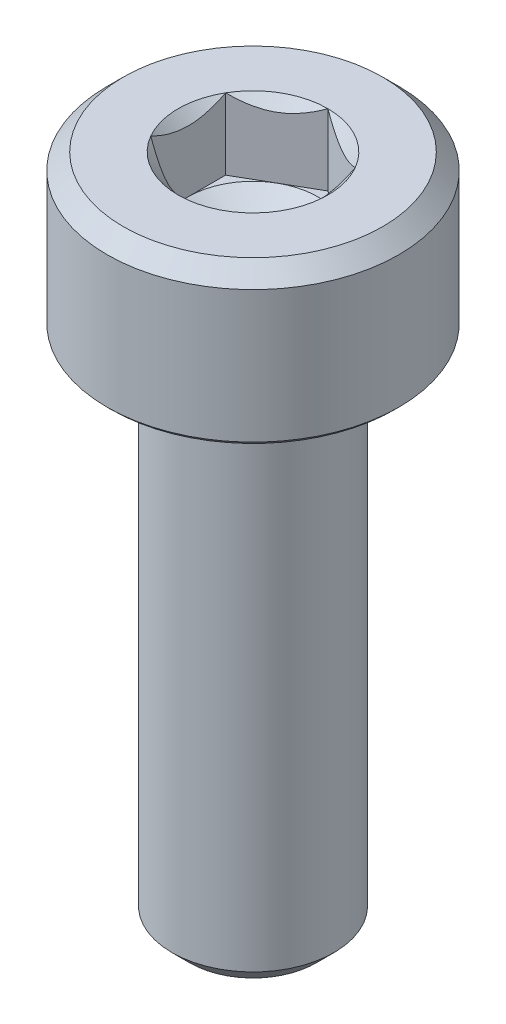
ISO-10303-21;
HEADER;
FILE_DESCRIPTION(('STEP AP214'),'2;1');
FILE_NAME('part.step','',(''),(''),'','','');
FILE_SCHEMA(('AUTOMOTIVE_DESIGN { 1 0 10303 214 1 1 1 1 }'));
ENDSEC;
DATA;
#1=APPLICATION_CONTEXT('core data for automotive mechanical design processes');
#2=APPLICATION_PROTOCOL_DEFINITION('international standard','automotive_design',2000,#1);
#3=PRODUCT_CONTEXT('',#1,'mechanical');
#4=PRODUCT('Part','Part','',(#3));
#5=PRODUCT_RELATED_PRODUCT_CATEGORY('part','',(#4));
#6=PRODUCT_DEFINITION_FORMATION('','',#4);
#7=PRODUCT_DEFINITION_CONTEXT('part definition',#1,'design');
#8=PRODUCT_DEFINITION('design','',#6,#7);
#9=PRODUCT_DEFINITION_SHAPE('','',#8);
#10=(LENGTH_UNIT() NAMED_UNIT(*) SI_UNIT(.MILLI.,.METRE.));
#11=(NAMED_UNIT(*) PLANE_ANGLE_UNIT() SI_UNIT($,.RADIAN.));
#12=(NAMED_UNIT(*) SI_UNIT($,.STERADIAN.) SOLID_ANGLE_UNIT());
#13=UNCERTAINTY_MEASURE_WITH_UNIT(LENGTH_MEASURE(1.E-05),#10,'distance_accuracy_value','');
#14=(GEOMETRIC_REPRESENTATION_CONTEXT(3) GLOBAL_UNCERTAINTY_ASSIGNED_CONTEXT((#13)) GLOBAL_UNIT_ASSIGNED_CONTEXT((#10,
#11,#12)) REPRESENTATION_CONTEXT('',''));
#15=CARTESIAN_POINT('',(0.,0.,0.));
#16=DIRECTION('',(0.,0.,1.));
#17=DIRECTION('',(1.,0.,0.));
#18=AXIS2_PLACEMENT_3D('',#15,#16,#17);
#19=CARTESIAN_POINT('',(0.,2.35,0.));
#20=DIRECTION('',(0.,1.,0.));
#21=DIRECTION('',(0.,0.,1.));
#22=AXIS2_PLACEMENT_3D('',#19,#20,#21);
#23=CONICAL_SURFACE('',#22,1.1547005383793,0.785398163397454);
#24=CARTESIAN_POINT('',(0.,2.35,0.));
#25=DIRECTION('',(0.,1.,0.));
#26=DIRECTION('',(0.,0.,1.));
#27=AXIS2_PLACEMENT_3D('',#24,#25,#26);
#28=CIRCLE('',#27,1.1547005383793);
#29=CARTESIAN_POINT('',(-1.,2.35,-0.57735026918963));
#30=VERTEX_POINT('',#29);
#31=CARTESIAN_POINT('',(-1.00000000000008,2.35,0.577350269189583));
#32=VERTEX_POINT('',#31);
#33=EDGE_CURVE('E248',#30,#32,#28,.T.);
#34=ORIENTED_EDGE('',*,*,#33,.T.);
#35=CARTESIAN_POINT('',(-1.,3.20441423009723,1.74256768962084));
#36=CARTESIAN_POINT('',(-1.,3.15972341116788,1.69102059122192));
#37=CARTESIAN_POINT('',(-1.,3.1152915811127,1.63924425922572));
#38=CARTESIAN_POINT('',(-1.,3.02713057656858,1.53505528716963));
#39=CARTESIAN_POINT('',(-1.,2.9834017464393,1.48264235609356));
#40=CARTESIAN_POINT('',(-1.,2.89587899152112,1.37583646199894));
#41=CARTESIAN_POINT('',(-1.,2.85210671468559,1.32142568747326));
#42=CARTESIAN_POINT('',(-1.,2.76589175836916,1.21157803433332));
#43=CARTESIAN_POINT('',(-1.,2.72344874835537,1.15614141634597));
#44=CARTESIAN_POINT('',(-1.,2.64034006340722,1.04382633838025));
#45=CARTESIAN_POINT('',(-1.,2.59967684847268,0.98694604439841));
#46=CARTESIAN_POINT('',(-1.,2.52096607516809,0.871316653880703));
#47=CARTESIAN_POINT('',(-1.,2.48292066188795,0.812566081113504));
#48=CARTESIAN_POINT('',(-1.,2.4110771081758,0.693091886197738));
#49=CARTESIAN_POINT('',(-1.,2.37724846072845,0.632386986032579));
#50=CARTESIAN_POINT('',(-1.,2.31564981540583,0.508043754863361));
#51=CARTESIAN_POINT('',(-1.,2.28786867121202,0.444411087000918));
#52=CARTESIAN_POINT('',(-1.,2.24104756523375,0.312160406801317));
#53=CARTESIAN_POINT('',(-1.,2.22221617277833,0.243462902700245));
#54=CARTESIAN_POINT('',(-1.,2.20430946266557,0.13886372810612));
#55=CARTESIAN_POINT('',(-1.,2.20006161975056,0.10383492202702));
#56=CARTESIAN_POINT('',(-1.,2.19524824338196,0.0335184669705135));
#57=CARTESIAN_POINT('',(-1.,2.19468232275134,-0.00176915440015586));
#58=CARTESIAN_POINT('',(-1.,2.19728567146494,-0.0722454641694516));
#59=CARTESIAN_POINT('',(-1.,2.20045951869865,-0.107433978350621));
#60=CARTESIAN_POINT('',(-1.,2.21030890755134,-0.177319989106464));
#61=CARTESIAN_POINT('',(-1.,2.21698572471288,-0.212017302089621));
#62=CARTESIAN_POINT('',(-1.,2.23346133219279,-0.280907053379187));
#63=CARTESIAN_POINT('',(-1.,2.24328169435811,-0.315094242601519));
#64=CARTESIAN_POINT('',(-1.,2.2655185240127,-0.382599620830743));
#65=CARTESIAN_POINT('',(-1.,2.27793502042904,-0.415917800150159));
#66=CARTESIAN_POINT('',(-1.,2.32437646172615,-0.529387744254411));
#67=CARTESIAN_POINT('',(-1.,2.36362512408433,-0.607386884983835));
#68=CARTESIAN_POINT('',(-1.,2.44935004559903,-0.75932693106452));
#69=CARTESIAN_POINT('',(-1.,2.49584456047756,-0.833256929627333));
#70=CARTESIAN_POINT('',(-1.,2.59341092820427,-0.978578376827047));
#71=CARTESIAN_POINT('',(-1.,2.64450595445919,-1.04995411555989));
#72=CARTESIAN_POINT('',(-1.,2.74939536195139,-1.19054254642276));
#73=CARTESIAN_POINT('',(-1.,2.80318672761588,-1.25975752044739));
#74=CARTESIAN_POINT('',(-1.,2.91439013810755,-1.39896109157942));
#75=CARTESIAN_POINT('',(-1.,2.97186306668785,-1.46890074421482));
#76=CARTESIAN_POINT('',(-1.,3.08756900021564,-1.6068655331689));
#77=CARTESIAN_POINT('',(-1.,3.14578702473006,-1.67490320212163));
#78=CARTESIAN_POINT('',(-1.,3.20441423009713,-1.74256768962092));
#79=B_SPLINE_CURVE_WITH_KNOTS('',3,(#35,#36,#37,#38,#39,#40,#41,#42,#43,#44,#45,#46,#47,#48,#49,
#50,#51,#52,#53,#54,#55,#56,#57,#58,#59,#60,#61,#62,#63,#64,#65,#66,#67,#68,#69,#70,#71,#72,#73,
#74,#75,#76,#77,#78),.UNSPECIFIED.,.F.,.F.,(4,2,2,2,2,2,2,2,2,2,2,2,2,2,2,2,2,2,2,2,2,4),(0.,
0.204673311659162,0.409444000678031,0.618925738744238,0.828354967118347,1.03806506988039,
1.24794501662875,1.45620552083532,1.66407886185753,1.87658414729778,1.98226906110216,
2.08794286130051,2.19374615241736,2.29958799663801,2.40617231345953,2.5127578179453,
2.77391338947342,3.03573790186776,3.29896416617097,3.56190233677242,3.8334547558109,
4.10206519642282),.UNSPECIFIED.);
#80=EDGE_CURVE('E135',#32,#30,#79,.T.);
#81=ORIENTED_EDGE('',*,*,#80,.T.);
#82=EDGE_LOOP('',(#34,#81));
#83=FACE_BOUND('',#82,.T.);
#84=ADVANCED_FACE('F43',(#83),#23,.F.);
#85=CARTESIAN_POINT('',(0.,2.35,-1.15470053837927));
#86=VERTEX_POINT('',#85);
#87=EDGE_CURVE('E250',#86,#30,#28,.T.);
#88=ORIENTED_EDGE('',*,*,#87,.T.);
#89=CARTESIAN_POINT('',(-1.0002,2.35011548737257,-0.577234799135792));
#90=CARTESIAN_POINT('',(-0.965817404992819,2.33027793082569,-0.597085599618626));
#91=CARTESIAN_POINT('',(-0.930859881860175,2.31160502063884,-0.617268335009461));
#92=CARTESIAN_POINT('',(-0.85957719704391,2.27741474272311,-0.65842341227669));
#93=CARTESIAN_POINT('',(-0.823245249471015,2.26191640902341,-0.679399671988085));
#94=CARTESIAN_POINT('',(-0.749983386196688,2.23536730714222,-0.721697428470851));
#95=CARTESIAN_POINT('',(-0.713072148554584,2.22424977399688,-0.743008141459641));
#96=CARTESIAN_POINT('',(-0.63843727068914,2.20711986577614,-0.786098608286191));
#97=CARTESIAN_POINT('',(-0.600715911891363,2.20109469746663,-0.807877044942286));
#98=CARTESIAN_POINT('',(-0.535707801582065,2.19566055496745,-0.845409494928868));
#99=CARTESIAN_POINT('',(-0.508505628471826,2.19485693831669,-0.861114676896607));
#100=CARTESIAN_POINT('',(-0.454153959330885,2.19620669941684,-0.892494627706035));
#101=CARTESIAN_POINT('',(-0.427004476245121,2.19836072954716,-0.90816938907396));
#102=CARTESIAN_POINT('',(-0.345943722673036,2.20911697212843,-0.954969836969517));
#103=CARTESIAN_POINT('',(-0.292435859021568,2.22201455641531,-0.985862616452454));
#104=CARTESIAN_POINT('',(-0.19852393485656,2.25314073060214,-1.04008269114924));
#105=CARTESIAN_POINT('',(-0.157679476328155,2.2697377977018,-1.06366425027552));
#106=CARTESIAN_POINT('',(-0.0775903626180415,2.30712492468526,-1.10990372163521));
#107=CARTESIAN_POINT('',(-0.0383409891295452,2.32790134181737,-1.13256435798432));
#108=CARTESIAN_POINT('',(0.000200000000019235,2.35011548737258,-1.1548160084331));
#109=B_SPLINE_CURVE_WITH_KNOTS('',3,(#89,#90,#91,#92,#93,#94,#95,#96,#97,#98,#99,#100,#101,#102,
#103,#104,#105,#106,#107,#108),.UNSPECIFIED.,.F.,.F.,(4,2,2,2,2,2,2,2,2,4),(0.,
0.133237676828559,0.267252229834491,0.399137076269301,0.530689603280769,0.624814864263848,
0.718960890149136,0.907306626112103,1.05710100361791,1.20641411519288),.UNSPECIFIED.);
#110=EDGE_CURVE('E210',#30,#86,#109,.T.);
#111=ORIENTED_EDGE('',*,*,#110,.T.);
#112=EDGE_LOOP('',(#88,#111));
#113=FACE_BOUND('',#112,.T.);
#114=ADVANCED_FACE('F294',(#113),#23,.F.);
#115=CARTESIAN_POINT('',(1.00000000000004,2.35,-0.57735026918963));
#116=VERTEX_POINT('',#115);
#117=EDGE_CURVE('E247',#116,#86,#28,.T.);
#118=ORIENTED_EDGE('',*,*,#117,.T.);
#119=CARTESIAN_POINT('',(-0.000199999999980755,2.35011548737258,-1.1548160084331));
#120=CARTESIAN_POINT('',(0.0341825950071998,2.3302779308257,-1.13496520795027));
#121=CARTESIAN_POINT('',(0.0691401181398438,2.31160502063886,-1.11478247255944));
#122=CARTESIAN_POINT('',(0.140422802956108,2.27741474272313,-1.07362739529221));
#123=CARTESIAN_POINT('',(0.176754750529003,2.26191640902343,-1.05265113558081));
#124=CARTESIAN_POINT('',(0.250016613803329,2.23536730714224,-1.01035337909805));
#125=CARTESIAN_POINT('',(0.286927851445432,2.2242497739969,-0.989042666109257));
#126=CARTESIAN_POINT('',(0.361562729310876,2.20711986577616,-0.945952199282708));
#127=CARTESIAN_POINT('',(0.399284088108653,2.20109469746665,-0.924173762626613));
#128=CARTESIAN_POINT('',(0.464292198417951,2.19566055496747,-0.886641312640031));
#129=CARTESIAN_POINT('',(0.49149437152819,2.19485693831671,-0.870936130672291));
#130=CARTESIAN_POINT('',(0.545846040669132,2.19620669941686,-0.839556179862863));
#131=CARTESIAN_POINT('',(0.572995523754896,2.19836072954718,-0.823881418494938));
#132=CARTESIAN_POINT('',(0.654056277326983,2.20911697212845,-0.77708097059938));
#133=CARTESIAN_POINT('',(0.707564140978452,2.22201455641533,-0.746188191116442));
#134=CARTESIAN_POINT('',(0.80147606514346,2.25314073060216,-0.691968116419659));
#135=CARTESIAN_POINT('',(0.842320523671865,2.26973779770182,-0.66838655729338));
#136=CARTESIAN_POINT('',(0.922409637381978,2.30712492468528,-0.622147085933688));
#137=CARTESIAN_POINT('',(0.961659010870474,2.32790134181739,-0.59948644958458));
#138=CARTESIAN_POINT('',(1.00020000000004,2.3501154873726,-0.577234799135792));
#139=B_SPLINE_CURVE_WITH_KNOTS('',3,(#119,#120,#121,#122,#123,#124,#125,#126,#127,#128,#129,
#130,#131,#132,#133,#134,#135,#136,#137,#138),.UNSPECIFIED.,.F.,.F.,(4,2,2,2,2,2,2,2,2,4),(0.,
0.133237676828558,0.267252229834487,0.399137076269296,0.530689603280762,0.624814864263843,
0.718960890149133,0.907306626112103,1.05710100361791,1.20641411519288),.UNSPECIFIED.);
#140=EDGE_CURVE('E261',#86,#116,#139,.T.);
#141=ORIENTED_EDGE('',*,*,#140,.T.);
#142=EDGE_LOOP('',(#118,#141));
#143=FACE_BOUND('',#142,.T.);
#144=ADVANCED_FACE('F259',(#143),#23,.F.);
#145=CARTESIAN_POINT('',(1.00000000000004,2.35,0.57735026918963));
#146=VERTEX_POINT('',#145);
#147=EDGE_CURVE('E242',#146,#116,#28,.T.);
#148=ORIENTED_EDGE('',*,*,#147,.T.);
#149=CARTESIAN_POINT('',(1.00000000000004,3.20441423009724,-1.74256768962084));
#150=CARTESIAN_POINT('',(1.00000000000004,3.15972341116789,-1.69102059122192));
#151=CARTESIAN_POINT('',(1.00000000000004,3.11529158111272,-1.63924425922572));
#152=CARTESIAN_POINT('',(1.00000000000004,3.0271305765686,-1.53505528716962));
#153=CARTESIAN_POINT('',(1.00000000000004,2.98340174643932,-1.48264235609356));
#154=CARTESIAN_POINT('',(1.00000000000004,2.89587899152114,-1.37583646199894));
#155=CARTESIAN_POINT('',(1.00000000000004,2.85210671468561,-1.32142568747326));
#156=CARTESIAN_POINT('',(1.00000000000004,2.76589175836918,-1.21157803433331));
#157=CARTESIAN_POINT('',(1.00000000000004,2.72344874835539,-1.15614141634597));
#158=CARTESIAN_POINT('',(1.00000000000004,2.64034006340724,-1.04382633838024));
#159=CARTESIAN_POINT('',(1.00000000000004,2.5996768484727,-0.986946044398403));
#160=CARTESIAN_POINT('',(1.00000000000004,2.52096607516812,-0.871316653880694));
#161=CARTESIAN_POINT('',(1.00000000000004,2.48292066188797,-0.812566081113494));
#162=CARTESIAN_POINT('',(1.00000000000004,2.41107710817583,-0.693091886197727));
#163=CARTESIAN_POINT('',(1.00000000000004,2.37724846072847,-0.632386986032566));
#164=CARTESIAN_POINT('',(1.00000000000004,2.31564981540585,-0.508043754863347));
#165=CARTESIAN_POINT('',(1.00000000000004,2.28786867121205,-0.444411087000902));
#166=CARTESIAN_POINT('',(1.00000000000004,2.24104756523378,-0.3121604068013));
#167=CARTESIAN_POINT('',(1.00000000000004,2.22221617277836,-0.243462902700227));
#168=CARTESIAN_POINT('',(1.00000000000004,2.20430946266561,-0.138863728106101));
#169=CARTESIAN_POINT('',(1.00000000000004,2.20006161975059,-0.103834922027));
#170=CARTESIAN_POINT('',(1.00000000000004,2.195248243382,-0.0335184669704929));
#171=CARTESIAN_POINT('',(1.00000000000004,2.19468232275138,0.00176915440017665));
#172=CARTESIAN_POINT('',(1.00000000000004,2.19728567146498,0.0722454641694729));
#173=CARTESIAN_POINT('',(1.00000000000004,2.20045951869869,0.107433978350643));
#174=CARTESIAN_POINT('',(1.00000000000004,2.21030890755138,0.177319989106486));
#175=CARTESIAN_POINT('',(1.00000000000004,2.21698572471292,0.212017302089643));
#176=CARTESIAN_POINT('',(1.00000000000004,2.23346133219283,0.280907053379209));
#177=CARTESIAN_POINT('',(1.00000000000004,2.24328169435815,0.315094242601541));
#178=CARTESIAN_POINT('',(1.00000000000004,2.26551852401275,0.382599620830765));
#179=CARTESIAN_POINT('',(1.00000000000004,2.27793502042908,0.415917800150181));
#180=CARTESIAN_POINT('',(1.00000000000004,2.3243764617262,0.529387744254438));
#181=CARTESIAN_POINT('',(1.00000000000004,2.36362512408437,0.607386884983866));
#182=CARTESIAN_POINT('',(1.00000000000004,2.44935004559909,0.759326931064559));
#183=CARTESIAN_POINT('',(1.00000000000004,2.49584456047762,0.833256929627375));
#184=CARTESIAN_POINT('',(1.00000000000004,2.59341092820434,0.978578376827097));
#185=CARTESIAN_POINT('',(1.00000000000004,2.64450595445925,1.04995411555995));
#186=CARTESIAN_POINT('',(1.00000000000004,2.74939536195146,1.19054254642283));
#187=CARTESIAN_POINT('',(1.00000000000004,2.80318672761596,1.25975752044745));
#188=CARTESIAN_POINT('',(1.00000000000004,2.91439013810762,1.39896109157947));
#189=CARTESIAN_POINT('',(1.00000000000004,2.97186306668791,1.46890074421487));
#190=CARTESIAN_POINT('',(1.00000000000004,3.08756900021567,1.60686553316892));
#191=CARTESIAN_POINT('',(1.00000000000004,3.14578702473009,1.67490320212164));
#192=CARTESIAN_POINT('',(1.00000000000004,3.20441423009714,1.74256768962092));
#193=B_SPLINE_CURVE_WITH_KNOTS('',3,(#149,#150,#151,#152,#153,#154,#155,#156,#157,#158,#159,
#160,#161,#162,#163,#164,#165,#166,#167,#168,#169,#170,#171,#172,#173,#174,#175,#176,#177,#178,
#179,#180,#181,#182,#183,#184,#185,#186,#187,#188,#189,#190,#191,#192),.UNSPECIFIED.,.F.,.F.,(4,
2,2,2,2,2,2,2,2,2,2,2,2,2,2,2,2,2,2,2,2,4),(0.,0.204673311659162,0.409444000678033,
0.61892573874424,0.828354967118351,1.0380650698804,1.24794501662876,1.45620552083532,
1.66407886185754,1.87658414729779,1.98226906110218,2.08794286130052,2.19374615241738,
2.29958799663803,2.40617231345955,2.51275781794531,2.77391338947345,3.0357379018678,
3.29896416617103,3.56190233677249,3.83345475581093,4.10206519642281),.UNSPECIFIED.);
#194=EDGE_CURVE('E269',#116,#146,#193,.T.);
#195=ORIENTED_EDGE('',*,*,#194,.T.);
#196=EDGE_LOOP('',(#148,#195));
#197=FACE_BOUND('',#196,.T.);
#198=ADVANCED_FACE('F268',(#197),#23,.F.);
#199=CARTESIAN_POINT('',(0.,2.35,1.15470053837927));
#200=VERTEX_POINT('',#199);
#201=EDGE_CURVE('E240',#200,#146,#28,.T.);
#202=ORIENTED_EDGE('',*,*,#201,.T.);
#203=CARTESIAN_POINT('',(1.00020000000004,2.3501154873726,0.577234799135792));
#204=CARTESIAN_POINT('',(0.965817404992856,2.33027793082572,0.597085599618627));
#205=CARTESIAN_POINT('',(0.93085988186021,2.31160502063887,0.617268335009462));
#206=CARTESIAN_POINT('',(0.859577197043941,2.27741474272314,0.658423412276694));
#207=CARTESIAN_POINT('',(0.823245249471044,2.26191640902344,0.67939967198809));
#208=CARTESIAN_POINT('',(0.749983386196713,2.23536730714224,0.721697428470858));
#209=CARTESIAN_POINT('',(0.713072148554608,2.2242497739969,0.74300814145965));
#210=CARTESIAN_POINT('',(0.638437270689158,2.20711986577616,0.786098608286202));
#211=CARTESIAN_POINT('',(0.60071591189138,2.20109469746665,0.807877044942298));
#212=CARTESIAN_POINT('',(0.535707801582079,2.19566055496747,0.845409494928882));
#213=CARTESIAN_POINT('',(0.508505628471839,2.19485693831671,0.861114676896622));
#214=CARTESIAN_POINT('',(0.454153959330897,2.19620669941686,0.89249462770605));
#215=CARTESIAN_POINT('',(0.427004476245133,2.19836072954717,0.908169389073975));
#216=CARTESIAN_POINT('',(0.345943722673045,2.20911697212845,0.954969836969534));
#217=CARTESIAN_POINT('',(0.292435859021576,2.22201455641533,0.985862616452471));
#218=CARTESIAN_POINT('',(0.198523934856573,2.25314073060215,1.04008269114925));
#219=CARTESIAN_POINT('',(0.157679476328174,2.26973779770181,1.06366425027553));
#220=CARTESIAN_POINT('',(0.0775903626180703,2.30712492468526,1.10990372163521));
#221=CARTESIAN_POINT('',(0.038340989129579,2.32790134181737,1.13256435798432));
#222=CARTESIAN_POINT('',(-0.000199999999980611,2.35011548737258,1.1548160084331));
#223=B_SPLINE_CURVE_WITH_KNOTS('',3,(#203,#204,#205,#206,#207,#208,#209,#210,#211,#212,#213,
#214,#215,#216,#217,#218,#219,#220,#221,#222),.UNSPECIFIED.,.F.,.F.,(4,2,2,2,2,2,2,2,2,4),(0.,
0.133237676828567,0.267252229834506,0.399137076269324,0.5306896032808,0.624814864263881,
0.718960890149171,0.907306626112142,1.05710100361793,1.20641411519288),.UNSPECIFIED.);
#224=EDGE_CURVE('E179',#146,#200,#223,.T.);
#225=ORIENTED_EDGE('',*,*,#224,.T.);
#226=EDGE_LOOP('',(#202,#225));
#227=FACE_BOUND('',#226,.T.);
#228=ADVANCED_FACE('F299',(#227),#23,.F.);
#229=EDGE_CURVE('E239',#32,#200,#28,.T.);
#230=ORIENTED_EDGE('',*,*,#229,.T.);
#231=CARTESIAN_POINT('',(0.000200000000019245,2.35011548737258,1.1548160084331));
#232=CARTESIAN_POINT('',(-0.0341825950071629,2.3302779308257,1.13496520795027));
#233=CARTESIAN_POINT('',(-0.0691401181398087,2.31160502063885,1.11478247255943));
#234=CARTESIAN_POINT('',(-0.140422802956077,2.27741474272312,1.0736273952922));
#235=CARTESIAN_POINT('',(-0.176754750528973,2.26191640902342,1.05265113558081));
#236=CARTESIAN_POINT('',(-0.250016613803303,2.23536730714222,1.01035337909804));
#237=CARTESIAN_POINT('',(-0.286927851445408,2.22424977399688,0.989042666109248));
#238=CARTESIAN_POINT('',(-0.361562729310857,2.20711986577614,0.945952199282697));
#239=CARTESIAN_POINT('',(-0.399284088108635,2.20109469746663,0.924173762626601));
#240=CARTESIAN_POINT('',(-0.464292198417935,2.19566055496745,0.886641312640018));
#241=CARTESIAN_POINT('',(-0.491494371528174,2.19485693831669,0.870936130672278));
#242=CARTESIAN_POINT('',(-0.545846040669115,2.19620669941684,0.839556179862851));
#243=CARTESIAN_POINT('',(-0.572995523754879,2.19836072954716,0.823881418494926));
#244=CARTESIAN_POINT('',(-0.654056277326965,2.20911697212843,0.777080970599368));
#245=CARTESIAN_POINT('',(-0.707564140978433,2.22201455641531,0.746188191116431));
#246=CARTESIAN_POINT('',(-0.801476065143437,2.25314073060213,0.691968116419651));
#247=CARTESIAN_POINT('',(-0.842320523671838,2.2697377977018,0.668386557293373));
#248=CARTESIAN_POINT('',(-0.922409637381945,2.30712492468525,0.622147085933684));
#249=CARTESIAN_POINT('',(-0.961659010870439,2.32790134181736,0.599486449584579));
#250=CARTESIAN_POINT('',(-1.0002,2.35011548737257,0.577234799135792));
#251=B_SPLINE_CURVE_WITH_KNOTS('',3,(#231,#232,#233,#234,#235,#236,#237,#238,#239,#240,#241,
#242,#243,#244,#245,#246,#247,#248,#249,#250),.UNSPECIFIED.,.F.,.F.,(4,2,2,2,2,2,2,2,2,4),(0.,
0.133237676828566,0.267252229834503,0.399137076269319,0.530689603280794,0.624814864263873,
0.718960890149162,0.907306626112129,1.05710100361792,1.20641411519289),.UNSPECIFIED.);
#252=EDGE_CURVE('E66',#200,#32,#251,.T.);
#253=ORIENTED_EDGE('',*,*,#252,.T.);
#254=EDGE_LOOP('',(#230,#253));
#255=FACE_BOUND('',#254,.T.);
#256=ADVANCED_FACE('F186',(#255),#23,.F.);
#257=CARTESIAN_POINT('',(1.1547005383793,2.35,0.));
#258=DIRECTION('',(0.,-1.,0.));
#259=DIRECTION('',(0.,0.,-1.));
#260=AXIS2_PLACEMENT_3D('',#257,#258,#259);
#261=PLANE('',#260);
#262=ORIENTED_EDGE('',*,*,#201,.F.);
#263=ORIENTED_EDGE('',*,*,#229,.F.);
#264=ORIENTED_EDGE('',*,*,#33,.F.);
#265=ORIENTED_EDGE('',*,*,#87,.F.);
#266=ORIENTED_EDGE('',*,*,#117,.F.);
#267=ORIENTED_EDGE('',*,*,#147,.F.);
#268=EDGE_LOOP('',(#262,#263,#264,#265,#266,#267));
#269=FACE_BOUND('',#268,.T.);
#270=CARTESIAN_POINT('',(0.,2.35,0.));
#271=DIRECTION('',(0.,1.,0.));
#272=DIRECTION('',(0.,0.,1.));
#273=AXIS2_PLACEMENT_3D('',#270,#271,#272);
#274=CIRCLE('',#273,2.);
#275=CARTESIAN_POINT('',(0.,2.35,2.));
#276=VERTEX_POINT('',#275);
#277=EDGE_CURVE('E237',#276,#276,#274,.T.);
#278=ORIENTED_EDGE('',*,*,#277,.T.);
#279=EDGE_LOOP('',(#278));
#280=FACE_BOUND('',#279,.T.);
#281=ADVANCED_FACE('F265',(#269,#280),#261,.F.);
#282=CARTESIAN_POINT('',(0.,2.1,0.));
#283=DIRECTION('',(0.,-1.,0.));
#284=DIRECTION('',(0.,0.,-1.));
#285=AXIS2_PLACEMENT_3D('',#282,#283,#284);
#286=CONICAL_SURFACE('',#285,2.25,0.785398163397452);
#287=ORIENTED_EDGE('',*,*,#277,.F.);
#288=EDGE_LOOP('',(#287));
#289=FACE_BOUND('',#288,.T.);
#290=CARTESIAN_POINT('',(0.,2.1,0.));
#291=DIRECTION('',(0.,1.,0.));
#292=DIRECTION('',(0.,0.,1.));
#293=AXIS2_PLACEMENT_3D('',#290,#291,#292);
#294=CIRCLE('',#293,2.25);
#295=CARTESIAN_POINT('',(0.,2.1,2.25));
#296=VERTEX_POINT('',#295);
#297=EDGE_CURVE('E234',#296,#296,#294,.T.);
#298=ORIENTED_EDGE('',*,*,#297,.T.);
#299=EDGE_LOOP('',(#298));
#300=FACE_BOUND('',#299,.T.);
#301=ADVANCED_FACE('F304',(#289,#300),#286,.T.);
#302=CARTESIAN_POINT('',(0.,-8.,0.));
#303=DIRECTION('',(0.,1.,0.));
#304=DIRECTION('',(0.,0.,1.));
#305=AXIS2_PLACEMENT_3D('',#302,#303,#304);
#306=CYLINDRICAL_SURFACE('',#305,2.25);
#307=ORIENTED_EDGE('',*,*,#297,.F.);
#308=EDGE_LOOP('',(#307));
#309=FACE_BOUND('',#308,.T.);
#310=CARTESIAN_POINT('',(0.,0.0625000000000001,0.));
#311=DIRECTION('',(0.,1.,0.));
#312=DIRECTION('',(0.,0.,1.));
#313=AXIS2_PLACEMENT_3D('',#310,#311,#312);
#314=CIRCLE('',#313,2.25);
#315=CARTESIAN_POINT('',(0.,0.0625000000000001,2.25));
#316=VERTEX_POINT('',#315);
#317=EDGE_CURVE('E231',#316,#316,#314,.T.);
#318=ORIENTED_EDGE('',*,*,#317,.T.);
#319=EDGE_LOOP('',(#318));
#320=FACE_BOUND('',#319,.T.);
#321=ADVANCED_FACE('F450',(#309,#320),#306,.T.);
#322=CARTESIAN_POINT('',(0.,0.,0.));
#323=DIRECTION('',(0.,1.,0.));
#324=DIRECTION('',(0.,0.,1.));
#325=AXIS2_PLACEMENT_3D('',#322,#323,#324);
#326=CONICAL_SURFACE('',#325,2.1875,0.785398163397448);
#327=ORIENTED_EDGE('',*,*,#317,.F.);
#328=EDGE_LOOP('',(#327));
#329=FACE_BOUND('',#328,.T.);
#330=CARTESIAN_POINT('',(0.,0.,0.));
#331=DIRECTION('',(0.,1.,0.));
#332=DIRECTION('',(0.,0.,1.));
#333=AXIS2_PLACEMENT_3D('',#330,#331,#332);
#334=CIRCLE('',#333,2.1875);
#335=CARTESIAN_POINT('',(0.,0.,2.1875));
#336=VERTEX_POINT('',#335);
#337=EDGE_CURVE('E228',#336,#336,#334,.T.);
#338=ORIENTED_EDGE('',*,*,#337,.T.);
#339=EDGE_LOOP('',(#338));
#340=FACE_BOUND('',#339,.T.);
#341=ADVANCED_FACE('F431',(#329,#340),#326,.T.);
#342=CARTESIAN_POINT('',(2.1875,0.,0.));
#343=DIRECTION('',(0.,1.,0.));
#344=DIRECTION('',(0.,0.,1.));
#345=AXIS2_PLACEMENT_3D('',#342,#343,#344);
#346=PLANE('',#345);
#347=ORIENTED_EDGE('',*,*,#337,.F.);
#348=EDGE_LOOP('',(#347));
#349=FACE_BOUND('',#348,.T.);
#350=CARTESIAN_POINT('',(0.,0.,0.));
#351=DIRECTION('',(0.,1.,0.));
#352=DIRECTION('',(0.,0.,1.));
#353=AXIS2_PLACEMENT_3D('',#350,#351,#352);
#354=CIRCLE('',#353,1.3);
#355=CARTESIAN_POINT('',(0.,0.,1.3));
#356=VERTEX_POINT('',#355);
#357=EDGE_CURVE('E225',#356,#356,#354,.T.);
#358=ORIENTED_EDGE('',*,*,#357,.T.);
#359=EDGE_LOOP('',(#358));
#360=FACE_BOUND('',#359,.T.);
#361=ADVANCED_FACE('F425',(#349,#360),#346,.F.);
#362=CARTESIAN_POINT('',(0.,-0.51,0.));
#363=DIRECTION('',(0.,1.,0.));
#364=DIRECTION('',(0.,0.,1.));
#365=AXIS2_PLACEMENT_3D('',#362,#363,#364);
#366=CONICAL_SURFACE('',#365,1.25,0.097726907358719);
#367=ORIENTED_EDGE('',*,*,#357,.F.);
#368=EDGE_LOOP('',(#367));
#369=FACE_BOUND('',#368,.T.);
#370=CARTESIAN_POINT('',(0.,-0.51,0.));
#371=DIRECTION('',(0.,1.,0.));
#372=DIRECTION('',(0.,0.,1.));
#373=AXIS2_PLACEMENT_3D('',#370,#371,#372);
#374=CIRCLE('',#373,1.25);
#375=CARTESIAN_POINT('',(0.,-0.51,1.25));
#376=VERTEX_POINT('',#375);
#377=EDGE_CURVE('E222',#376,#376,#374,.T.);
#378=ORIENTED_EDGE('',*,*,#377,.T.);
#379=EDGE_LOOP('',(#378));
#380=FACE_BOUND('',#379,.T.);
#381=ADVANCED_FACE('F430',(#369,#380),#366,.T.);
#382=CARTESIAN_POINT('',(0.,-8.,0.));
#383=DIRECTION('',(0.,1.,0.));
#384=DIRECTION('',(0.,0.,1.));
#385=AXIS2_PLACEMENT_3D('',#382,#383,#384);
#386=CYLINDRICAL_SURFACE('',#385,1.25);
#387=ORIENTED_EDGE('',*,*,#377,.F.);
#388=EDGE_LOOP('',(#387));
#389=FACE_BOUND('',#388,.T.);
#390=CARTESIAN_POINT('',(0.,-7.724,0.));
#391=DIRECTION('',(0.,1.,0.));
#392=DIRECTION('',(0.,0.,1.));
#393=AXIS2_PLACEMENT_3D('',#390,#391,#392);
#394=CIRCLE('',#393,1.25);
#395=CARTESIAN_POINT('',(0.,-7.724,1.25));
#396=VERTEX_POINT('',#395);
#397=EDGE_CURVE('E219',#396,#396,#394,.T.);
#398=ORIENTED_EDGE('',*,*,#397,.T.);
#399=EDGE_LOOP('',(#398));
#400=FACE_BOUND('',#399,.T.);
#401=ADVANCED_FACE('F472',(#389,#400),#386,.T.);
#402=CARTESIAN_POINT('',(0.,-8.,0.));
#403=DIRECTION('',(0.,1.,0.));
#404=DIRECTION('',(0.,0.,1.));
#405=AXIS2_PLACEMENT_3D('',#402,#403,#404);
#406=CONICAL_SURFACE('',#405,0.974,0.785398163397448);
#407=ORIENTED_EDGE('',*,*,#397,.F.);
#408=EDGE_LOOP('',(#407));
#409=FACE_BOUND('',#408,.T.);
#410=CARTESIAN_POINT('',(0.,-8.,0.));
#411=DIRECTION('',(0.,1.,0.));
#412=DIRECTION('',(0.,0.,1.));
#413=AXIS2_PLACEMENT_3D('',#410,#411,#412);
#414=CIRCLE('',#413,0.974);
#415=CARTESIAN_POINT('',(0.,-8.,0.974));
#416=VERTEX_POINT('',#415);
#417=EDGE_CURVE('E209',#416,#416,#414,.T.);
#418=ORIENTED_EDGE('',*,*,#417,.T.);
#419=EDGE_LOOP('',(#418));
#420=FACE_BOUND('',#419,.T.);
#421=ADVANCED_FACE('F418',(#409,#420),#406,.T.);
#422=CARTESIAN_POINT('',(0.974,-8.,0.));
#423=DIRECTION('',(0.,1.,0.));
#424=DIRECTION('',(0.,0.,1.));
#425=AXIS2_PLACEMENT_3D('',#422,#423,#424);
#426=PLANE('',#425);
#427=ORIENTED_EDGE('',*,*,#417,.F.);
#428=EDGE_LOOP('',(#427));
#429=FACE_BOUND('',#428,.T.);
#430=ADVANCED_FACE('F200',(#429),#426,.F.);
#431=CARTESIAN_POINT('',(0.,1.25,0.));
#432=DIRECTION('',(0.,1.,0.));
#433=DIRECTION('',(0.,0.,1.));
#434=AXIS2_PLACEMENT_3D('',#431,#432,#433);
#435=PLANE('',#434);
#436=CARTESIAN_POINT('',(0.,1.25,0.));
#437=DIRECTION('',(0.,1.,0.));
#438=DIRECTION('',(0.,0.,1.));
#439=AXIS2_PLACEMENT_3D('',#436,#437,#438);
#440=CIRCLE('',#439,1.);
#441=CARTESIAN_POINT('',(-1.,1.25,0.));
#442=VERTEX_POINT('',#441);
#443=CARTESIAN_POINT('',(-0.500000000000002,1.25,0.866025403784442));
#444=VERTEX_POINT('',#443);
#445=EDGE_CURVE('E125',#442,#444,#440,.T.);
#446=ORIENTED_EDGE('',*,*,#445,.F.);
#447=DIRECTION('',(0.,0.,1.));
#448=VECTOR('',#447,1.);
#449=CARTESIAN_POINT('',(-1.,1.25,-0.57735026918963));
#450=LINE('',#449,#448);
#451=CARTESIAN_POINT('',(-1.,1.25,0.57735026918963));
#452=VERTEX_POINT('',#451);
#453=EDGE_CURVE('E119',#442,#452,#450,.T.);
#454=ORIENTED_EDGE('',*,*,#453,.T.);
#455=DIRECTION('',(0.866025403784439,0.,0.5));
#456=VECTOR('',#455,1.);
#457=CARTESIAN_POINT('',(-1.,1.25,0.57735026918963));
#458=LINE('',#457,#456);
#459=EDGE_CURVE('E123',#452,#444,#458,.T.);
#460=ORIENTED_EDGE('',*,*,#459,.T.);
#461=EDGE_LOOP('',(#446,#454,#460));
#462=FACE_BOUND('',#461,.T.);
#463=ADVANCED_FACE('F121',(#462),#435,.T.);
#464=CARTESIAN_POINT('',(-0.500000000000002,1.25,-0.866025403784442));
#465=VERTEX_POINT('',#464);
#466=EDGE_CURVE('E593',#465,#442,#440,.T.);
#467=ORIENTED_EDGE('',*,*,#466,.F.);
#468=DIRECTION('',(-0.866025403784439,0.,0.5));
#469=VECTOR('',#468,1.);
#470=CARTESIAN_POINT('',(0.,1.25,-1.15470053837927));
#471=LINE('',#470,#469);
#472=CARTESIAN_POINT('',(-1.,1.25,-0.57735026918963));
#473=VERTEX_POINT('',#472);
#474=EDGE_CURVE('E157',#465,#473,#471,.T.);
#475=ORIENTED_EDGE('',*,*,#474,.T.);
#476=EDGE_CURVE('E129',#473,#442,#450,.T.);
#477=ORIENTED_EDGE('',*,*,#476,.T.);
#478=EDGE_LOOP('',(#467,#475,#477));
#479=FACE_BOUND('',#478,.T.);
#480=ADVANCED_FACE('F292',(#479),#435,.T.);
#481=CARTESIAN_POINT('',(0.500000000000012,1.25,-0.866025403784459));
#482=VERTEX_POINT('',#481);
#483=EDGE_CURVE('E596',#482,#465,#440,.T.);
#484=ORIENTED_EDGE('',*,*,#483,.F.);
#485=DIRECTION('',(-0.866025403784439,0.,-0.5));
#486=VECTOR('',#485,1.);
#487=CARTESIAN_POINT('',(1.00000000000004,1.25,-0.57735026918963));
#488=LINE('',#487,#486);
#489=CARTESIAN_POINT('',(0.,1.25,-1.15470053837927));
#490=VERTEX_POINT('',#489);
#491=EDGE_CURVE('E153',#482,#490,#488,.T.);
#492=ORIENTED_EDGE('',*,*,#491,.T.);
#493=EDGE_CURVE('E139',#490,#465,#471,.T.);
#494=ORIENTED_EDGE('',*,*,#493,.T.);
#495=EDGE_LOOP('',(#484,#492,#494));
#496=FACE_BOUND('',#495,.T.);
#497=ADVANCED_FACE('F381',(#496),#435,.T.);
#498=CARTESIAN_POINT('',(1.00000000000004,1.25,0.));
#499=VERTEX_POINT('',#498);
#500=EDGE_CURVE('E51',#499,#482,#440,.T.);
#501=ORIENTED_EDGE('',*,*,#500,.F.);
#502=DIRECTION('',(0.,0.,-1.));
#503=VECTOR('',#502,1.);
#504=CARTESIAN_POINT('',(1.00000000000004,1.25,0.57735026918963));
#505=LINE('',#504,#503);
#506=CARTESIAN_POINT('',(1.00000000000004,1.25,-0.57735026918963));
#507=VERTEX_POINT('',#506);
#508=EDGE_CURVE('E149',#499,#507,#505,.T.);
#509=ORIENTED_EDGE('',*,*,#508,.T.);
#510=EDGE_CURVE('E154',#507,#482,#488,.T.);
#511=ORIENTED_EDGE('',*,*,#510,.T.);
#512=EDGE_LOOP('',(#501,#509,#511));
#513=FACE_BOUND('',#512,.T.);
#514=ADVANCED_FACE('F290',(#513),#435,.T.);
#515=CARTESIAN_POINT('',(0.5,1.25,0.866025403784438));
#516=VERTEX_POINT('',#515);
#517=EDGE_CURVE('E11',#516,#499,#440,.T.);
#518=ORIENTED_EDGE('',*,*,#517,.F.);
#519=DIRECTION('',(0.866025403784438,0.,-0.5));
#520=VECTOR('',#519,1.);
#521=CARTESIAN_POINT('',(0.,1.25,1.15470053837927));
#522=LINE('',#521,#520);
#523=CARTESIAN_POINT('',(1.00000000000004,1.25,0.57735026918963));
#524=VERTEX_POINT('',#523);
#525=EDGE_CURVE('E145',#516,#524,#522,.T.);
#526=ORIENTED_EDGE('',*,*,#525,.T.);
#527=EDGE_CURVE('E150',#524,#499,#505,.T.);
#528=ORIENTED_EDGE('',*,*,#527,.T.);
#529=EDGE_LOOP('',(#518,#526,#528));
#530=FACE_BOUND('',#529,.T.);
#531=ADVANCED_FACE('F280',(#530),#435,.T.);
#532=EDGE_CURVE('E52',#444,#516,#440,.T.);
#533=ORIENTED_EDGE('',*,*,#532,.F.);
#534=CARTESIAN_POINT('',(0.,1.25,1.15470053837927));
#535=VERTEX_POINT('',#534);
#536=EDGE_CURVE('E144',#444,#535,#458,.T.);
#537=ORIENTED_EDGE('',*,*,#536,.T.);
#538=EDGE_CURVE('E59',#535,#516,#522,.T.);
#539=ORIENTED_EDGE('',*,*,#538,.T.);
#540=EDGE_LOOP('',(#533,#537,#539));
#541=FACE_BOUND('',#540,.T.);
#542=ADVANCED_FACE('F199',(#541),#435,.T.);
#543=CARTESIAN_POINT('',(-1.,1.25,-0.57735026918963));
#544=DIRECTION('',(-1.,0.,0.));
#545=DIRECTION('',(0.,0.,1.));
#546=AXIS2_PLACEMENT_3D('',#543,#544,#545);
#547=PLANE('',#546);
#548=ORIENTED_EDGE('',*,*,#80,.F.);
#549=DIRECTION('',(0.,1.,0.));
#550=VECTOR('',#549,1.);
#551=CARTESIAN_POINT('',(-1.,1.25,0.57735026918963));
#552=LINE('',#551,#550);
#553=EDGE_CURVE('E132',#452,#32,#552,.T.);
#554=ORIENTED_EDGE('',*,*,#553,.F.);
#555=ORIENTED_EDGE('',*,*,#453,.F.);
#556=ORIENTED_EDGE('',*,*,#476,.F.);
#557=DIRECTION('',(0.,1.,0.));
#558=VECTOR('',#557,1.);
#559=CARTESIAN_POINT('',(-1.,1.25,-0.57735026918963));
#560=LINE('',#559,#558);
#561=EDGE_CURVE('E160',#473,#30,#560,.T.);
#562=ORIENTED_EDGE('',*,*,#561,.T.);
#563=EDGE_LOOP('',(#548,#554,#555,#556,#562));
#564=FACE_BOUND('',#563,.T.);
#565=ADVANCED_FACE('F133',(#564),#547,.F.);
#566=CARTESIAN_POINT('',(0.,1.25,-1.15470053837927));
#567=DIRECTION('',(-0.5,0.,-0.866025403784439));
#568=DIRECTION('',(-0.866025403784439,0.,0.5));
#569=AXIS2_PLACEMENT_3D('',#566,#567,#568);
#570=PLANE('',#569);
#571=ORIENTED_EDGE('',*,*,#110,.F.);
#572=ORIENTED_EDGE('',*,*,#561,.F.);
#573=ORIENTED_EDGE('',*,*,#474,.F.);
#574=ORIENTED_EDGE('',*,*,#493,.F.);
#575=DIRECTION('',(0.,1.,0.));
#576=VECTOR('',#575,1.);
#577=CARTESIAN_POINT('',(0.,1.25,-1.15470053837927));
#578=LINE('',#577,#576);
#579=EDGE_CURVE('E162',#490,#86,#578,.T.);
#580=ORIENTED_EDGE('',*,*,#579,.T.);
#581=EDGE_LOOP('',(#571,#572,#573,#574,#580));
#582=FACE_BOUND('',#581,.T.);
#583=ADVANCED_FACE('F198',(#582),#570,.F.);
#584=CARTESIAN_POINT('',(1.00000000000004,1.25,-0.57735026918963));
#585=DIRECTION('',(0.5,0.,-0.866025403784439));
#586=DIRECTION('',(-0.866025403784439,0.,-0.5));
#587=AXIS2_PLACEMENT_3D('',#584,#585,#586);
#588=PLANE('',#587);
#589=ORIENTED_EDGE('',*,*,#140,.F.);
#590=ORIENTED_EDGE('',*,*,#579,.F.);
#591=ORIENTED_EDGE('',*,*,#491,.F.);
#592=ORIENTED_EDGE('',*,*,#510,.F.);
#593=DIRECTION('',(0.,1.,0.));
#594=VECTOR('',#593,1.);
#595=CARTESIAN_POINT('',(1.00000000000004,1.25,-0.57735026918963));
#596=LINE('',#595,#594);
#597=EDGE_CURVE('E165',#507,#116,#596,.T.);
#598=ORIENTED_EDGE('',*,*,#597,.T.);
#599=EDGE_LOOP('',(#589,#590,#591,#592,#598));
#600=FACE_BOUND('',#599,.T.);
#601=ADVANCED_FACE('F359',(#600),#588,.F.);
#602=CARTESIAN_POINT('',(1.00000000000004,1.25,0.57735026918963));
#603=DIRECTION('',(1.,0.,0.));
#604=DIRECTION('',(0.,0.,-1.));
#605=AXIS2_PLACEMENT_3D('',#602,#603,#604);
#606=PLANE('',#605);
#607=ORIENTED_EDGE('',*,*,#194,.F.);
#608=ORIENTED_EDGE('',*,*,#597,.F.);
#609=ORIENTED_EDGE('',*,*,#508,.F.);
#610=ORIENTED_EDGE('',*,*,#527,.F.);
#611=DIRECTION('',(0.,1.,0.));
#612=VECTOR('',#611,1.);
#613=CARTESIAN_POINT('',(1.00000000000004,1.25,0.57735026918963));
#614=LINE('',#613,#612);
#615=EDGE_CURVE('E168',#524,#146,#614,.T.);
#616=ORIENTED_EDGE('',*,*,#615,.T.);
#617=EDGE_LOOP('',(#607,#608,#609,#610,#616));
#618=FACE_BOUND('',#617,.T.);
#619=ADVANCED_FACE('F276',(#618),#606,.F.);
#620=CARTESIAN_POINT('',(0.,1.25,1.15470053837927));
#621=DIRECTION('',(0.5,0.,0.866025403784439));
#622=DIRECTION('',(0.866025403784438,0.,-0.5));
#623=AXIS2_PLACEMENT_3D('',#620,#621,#622);
#624=PLANE('',#623);
#625=ORIENTED_EDGE('',*,*,#224,.F.);
#626=ORIENTED_EDGE('',*,*,#615,.F.);
#627=ORIENTED_EDGE('',*,*,#525,.F.);
#628=ORIENTED_EDGE('',*,*,#538,.F.);
#629=DIRECTION('',(0.,1.,0.));
#630=VECTOR('',#629,1.);
#631=CARTESIAN_POINT('',(0.,1.25,1.15470053837927));
#632=LINE('',#631,#630);
#633=EDGE_CURVE('E138',#535,#200,#632,.T.);
#634=ORIENTED_EDGE('',*,*,#633,.T.);
#635=EDGE_LOOP('',(#625,#626,#627,#628,#634));
#636=FACE_BOUND('',#635,.T.);
#637=ADVANCED_FACE('F192',(#636),#624,.F.);
#638=CARTESIAN_POINT('',(-1.,1.25,0.57735026918963));
#639=DIRECTION('',(-0.5,0.,0.866025403784439));
#640=DIRECTION('',(0.866025403784439,0.,0.5));
#641=AXIS2_PLACEMENT_3D('',#638,#639,#640);
#642=PLANE('',#641);
#643=ORIENTED_EDGE('',*,*,#252,.F.);
#644=ORIENTED_EDGE('',*,*,#633,.F.);
#645=ORIENTED_EDGE('',*,*,#536,.F.);
#646=ORIENTED_EDGE('',*,*,#459,.F.);
#647=ORIENTED_EDGE('',*,*,#553,.T.);
#648=EDGE_LOOP('',(#643,#644,#645,#646,#647));
#649=FACE_BOUND('',#648,.T.);
#650=ADVANCED_FACE('F142',(#649),#642,.F.);
#651=CARTESIAN_POINT('',(0.,1.25,0.));
#652=DIRECTION('',(0.,1.,0.));
#653=DIRECTION('',(0.,0.,1.));
#654=AXIS2_PLACEMENT_3D('',#651,#652,#653);
#655=CONICAL_SURFACE('',#654,1.,1.04719755119659);
#656=CARTESIAN_POINT('',(0.,0.67264973081037,0.));
#657=VERTEX_POINT('',#656);
#658=VERTEX_LOOP('',#657);
#659=FACE_BOUND('',#658,.T.);
#660=ORIENTED_EDGE('',*,*,#517,.T.);
#661=ORIENTED_EDGE('',*,*,#500,.T.);
#662=ORIENTED_EDGE('',*,*,#483,.T.);
#663=ORIENTED_EDGE('',*,*,#466,.T.);
#664=ORIENTED_EDGE('',*,*,#445,.T.);
#665=ORIENTED_EDGE('',*,*,#532,.T.);
#666=EDGE_LOOP('',(#660,#661,#662,#663,#664,#665));
#667=FACE_BOUND('',#666,.T.);
#668=ADVANCED_FACE('F45',(#659,#667),#655,.F.);
#669=CLOSED_SHELL('',(#84,#114,#144,#198,#228,#256,#281,#301,#321,#341,#361,#381,#401,#421,#430,
#463,#480,#497,#514,#531,#542,#565,#583,#601,#619,#637,#650,#668));
#670=MANIFOLD_SOLID_BREP('B2',#669);
#671=ADVANCED_BREP_SHAPE_REPRESENTATION('',(#18,#670),#14);
#672=SHAPE_DEFINITION_REPRESENTATION(#9,#671);
ENDSEC;
END-ISO-10303-21;
